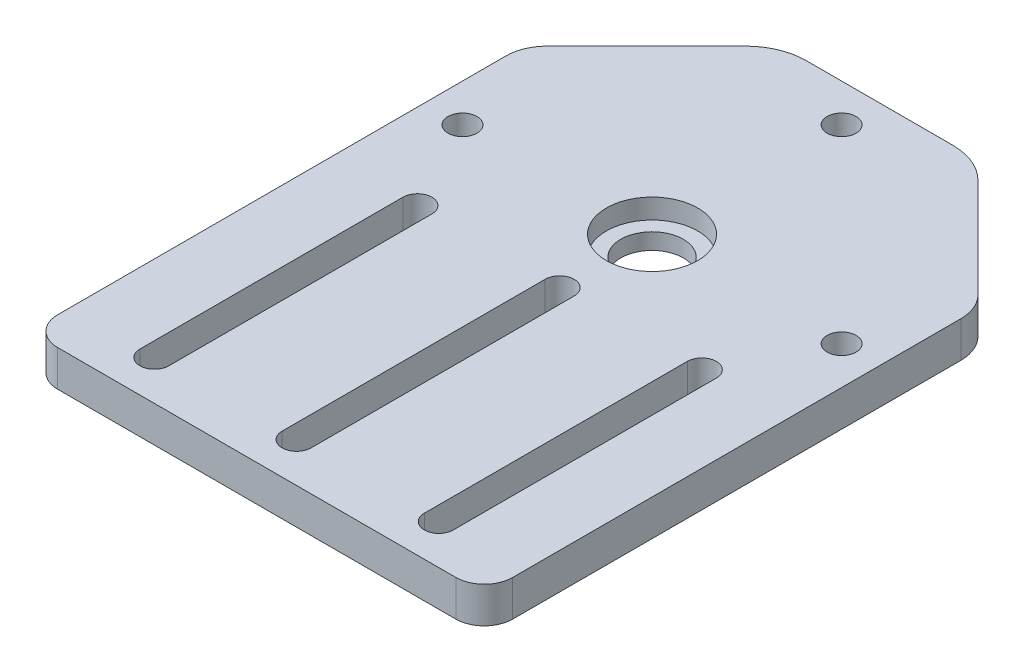
ISO-10303-21;
HEADER;
FILE_DESCRIPTION(('STEP AP214'),'2;1');
FILE_NAME('part.step','',(''),(''),'','','');
FILE_SCHEMA(('AUTOMOTIVE_DESIGN { 1 0 10303 214 1 1 1 1 }'));
ENDSEC;
DATA;
#1=APPLICATION_CONTEXT('core data for automotive mechanical design processes');
#2=APPLICATION_PROTOCOL_DEFINITION('international standard','automotive_design',2000,#1);
#3=PRODUCT_CONTEXT('',#1,'mechanical');
#4=PRODUCT('Part','Part','',(#3));
#5=PRODUCT_RELATED_PRODUCT_CATEGORY('part','',(#4));
#6=PRODUCT_DEFINITION_FORMATION('','',#4);
#7=PRODUCT_DEFINITION_CONTEXT('part definition',#1,'design');
#8=PRODUCT_DEFINITION('design','',#6,#7);
#9=PRODUCT_DEFINITION_SHAPE('','',#8);
#10=(LENGTH_UNIT() NAMED_UNIT(*) SI_UNIT(.MILLI.,.METRE.));
#11=(NAMED_UNIT(*) PLANE_ANGLE_UNIT() SI_UNIT($,.RADIAN.));
#12=(NAMED_UNIT(*) SI_UNIT($,.STERADIAN.) SOLID_ANGLE_UNIT());
#13=UNCERTAINTY_MEASURE_WITH_UNIT(LENGTH_MEASURE(1.E-05),#10,'distance_accuracy_value','');
#14=(GEOMETRIC_REPRESENTATION_CONTEXT(3) GLOBAL_UNCERTAINTY_ASSIGNED_CONTEXT((#13)) GLOBAL_UNIT_ASSIGNED_CONTEXT((#10,
#11,#12)) REPRESENTATION_CONTEXT('',''));
#15=CARTESIAN_POINT('',(0.,0.,0.));
#16=DIRECTION('',(0.,0.,1.));
#17=DIRECTION('',(1.,0.,0.));
#18=AXIS2_PLACEMENT_3D('',#15,#16,#17);
#19=CARTESIAN_POINT('',(0.,6.35,0.));
#20=DIRECTION('',(0.,-1.,0.));
#21=DIRECTION('',(0.,0.,-1.));
#22=AXIS2_PLACEMENT_3D('',#19,#20,#21);
#23=CYLINDRICAL_SURFACE('',#22,5.5);
#24=CARTESIAN_POINT('',(0.,0.,0.));
#25=DIRECTION('',(0.,1.,0.));
#26=DIRECTION('',(0.,0.,1.));
#27=AXIS2_PLACEMENT_3D('',#24,#25,#26);
#28=CIRCLE('',#27,5.5);
#29=CARTESIAN_POINT('',(0.,0.,5.5));
#30=VERTEX_POINT('',#29);
#31=EDGE_CURVE('E304',#30,#30,#28,.T.);
#32=ORIENTED_EDGE('',*,*,#31,.F.);
#33=EDGE_LOOP('',(#32));
#34=FACE_BOUND('',#33,.T.);
#35=CARTESIAN_POINT('',(0.,2.85,0.));
#36=DIRECTION('',(0.,1.,0.));
#37=DIRECTION('',(0.,0.,1.));
#38=AXIS2_PLACEMENT_3D('',#35,#36,#37);
#39=CIRCLE('',#38,5.5);
#40=CARTESIAN_POINT('',(0.,2.85,5.5));
#41=VERTEX_POINT('',#40);
#42=EDGE_CURVE('E45',#41,#41,#39,.T.);
#43=ORIENTED_EDGE('',*,*,#42,.T.);
#44=EDGE_LOOP('',(#43));
#45=FACE_BOUND('',#44,.T.);
#46=ADVANCED_FACE('F41',(#34,#45),#23,.F.);
#47=CARTESIAN_POINT('',(-35.,6.35,64.5));
#48=DIRECTION('',(0.,-1.,0.));
#49=DIRECTION('',(0.,0.,-1.));
#50=AXIS2_PLACEMENT_3D('',#47,#48,#49);
#51=PLANE('',#50);
#52=CARTESIAN_POINT('',(0.,6.35,0.));
#53=DIRECTION('',(0.,1.,0.));
#54=DIRECTION('',(0.,0.,1.));
#55=AXIS2_PLACEMENT_3D('',#52,#53,#54);
#56=CIRCLE('',#55,8.025);
#57=CARTESIAN_POINT('',(0.,6.35,8.025));
#58=VERTEX_POINT('',#57);
#59=EDGE_CURVE('E649',#58,#58,#56,.T.);
#60=ORIENTED_EDGE('',*,*,#59,.F.);
#61=EDGE_LOOP('',(#60));
#62=FACE_BOUND('',#61,.T.);
#63=CARTESIAN_POINT('',(0.,6.35,62.5));
#64=DIRECTION('',(0.,1.,0.));
#65=DIRECTION('',(0.,0.,1.));
#66=AXIS2_PLACEMENT_3D('',#63,#64,#65);
#67=CIRCLE('',#66,2.55);
#68=CARTESIAN_POINT('',(-2.55,6.35,62.5));
#69=VERTEX_POINT('',#68);
#70=CARTESIAN_POINT('',(2.55,6.35,62.5));
#71=VERTEX_POINT('',#70);
#72=EDGE_CURVE('E243',#69,#71,#67,.T.);
#73=ORIENTED_EDGE('',*,*,#72,.F.);
#74=DIRECTION('',(0.,0.,1.));
#75=VECTOR('',#74,1.);
#76=CARTESIAN_POINT('',(-2.55,6.35,62.5));
#77=LINE('',#76,#75);
#78=CARTESIAN_POINT('',(-2.55,6.35,16.25));
#79=VERTEX_POINT('',#78);
#80=EDGE_CURVE('E251',#79,#69,#77,.T.);
#81=ORIENTED_EDGE('',*,*,#80,.F.);
#82=CARTESIAN_POINT('',(0.,6.35,16.25));
#83=DIRECTION('',(0.,1.,0.));
#84=DIRECTION('',(0.,0.,1.));
#85=AXIS2_PLACEMENT_3D('',#82,#83,#84);
#86=CIRCLE('',#85,2.55);
#87=CARTESIAN_POINT('',(2.55,6.35,16.25));
#88=VERTEX_POINT('',#87);
#89=EDGE_CURVE('E248',#88,#79,#86,.T.);
#90=ORIENTED_EDGE('',*,*,#89,.F.);
#91=DIRECTION('',(0.,0.,-1.));
#92=VECTOR('',#91,1.);
#93=CARTESIAN_POINT('',(2.55,6.35,62.5));
#94=LINE('',#93,#92);
#95=EDGE_CURVE('E245',#71,#88,#94,.T.);
#96=ORIENTED_EDGE('',*,*,#95,.F.);
#97=EDGE_LOOP('',(#73,#81,#90,#96));
#98=FACE_BOUND('',#97,.T.);
#99=DIRECTION('',(0.,0.,1.));
#100=VECTOR('',#99,1.);
#101=CARTESIAN_POINT('',(-40.,6.35,27.5));
#102=LINE('',#101,#100);
#103=CARTESIAN_POINT('',(-40.,6.35,-14.3069516727951));
#104=VERTEX_POINT('',#103);
#105=CARTESIAN_POINT('',(-40.,6.35,64.5));
#106=VERTEX_POINT('',#105);
#107=EDGE_CURVE('E308',#104,#106,#102,.T.);
#108=ORIENTED_EDGE('',*,*,#107,.T.);
#109=CARTESIAN_POINT('',(-35.,6.35,64.5));
#110=DIRECTION('',(0.,1.,0.));
#111=DIRECTION('',(0.,0.,-1.));
#112=AXIS2_PLACEMENT_3D('',#109,#110,#111);
#113=CIRCLE('',#112,4.99999999999999);
#114=CARTESIAN_POINT('',(-35.,6.35,69.5));
#115=VERTEX_POINT('',#114);
#116=EDGE_CURVE('E311',#106,#115,#113,.T.);
#117=ORIENTED_EDGE('',*,*,#116,.T.);
#118=DIRECTION('',(1.,0.,0.));
#119=VECTOR('',#118,1.);
#120=CARTESIAN_POINT('',(-35.,6.35,69.5));
#121=LINE('',#120,#119);
#122=CARTESIAN_POINT('',(35.,6.35,69.5));
#123=VERTEX_POINT('',#122);
#124=EDGE_CURVE('E314',#115,#123,#121,.T.);
#125=ORIENTED_EDGE('',*,*,#124,.T.);
#126=CARTESIAN_POINT('',(35.,6.35,64.5));
#127=DIRECTION('',(0.,1.,0.));
#128=DIRECTION('',(0.,0.,-1.));
#129=AXIS2_PLACEMENT_3D('',#126,#127,#128);
#130=CIRCLE('',#129,4.99999999999999);
#131=CARTESIAN_POINT('',(40.,6.35,64.5));
#132=VERTEX_POINT('',#131);
#133=EDGE_CURVE('E316',#123,#132,#130,.T.);
#134=ORIENTED_EDGE('',*,*,#133,.T.);
#135=DIRECTION('',(0.,0.,-1.));
#136=VECTOR('',#135,1.);
#137=CARTESIAN_POINT('',(40.,6.35,64.5));
#138=LINE('',#137,#136);
#139=CARTESIAN_POINT('',(40.,6.35,-14.3069516727951));
#140=VERTEX_POINT('',#139);
#141=EDGE_CURVE('E318',#132,#140,#138,.T.);
#142=ORIENTED_EDGE('',*,*,#141,.T.);
#143=CARTESIAN_POINT('',(32.75,6.35,-14.3069516727951));
#144=DIRECTION('',(0.,1.,0.));
#145=DIRECTION('',(0.,0.,-1.));
#146=AXIS2_PLACEMENT_3D('',#143,#144,#145);
#147=CIRCLE('',#146,7.25);
#148=CARTESIAN_POINT('',(37.8765241636025,6.35,-19.4334758363976));
#149=VERTEX_POINT('',#148);
#150=EDGE_CURVE('E320',#140,#149,#147,.T.);
#151=ORIENTED_EDGE('',*,*,#150,.T.);
#152=DIRECTION('',(-0.707106781186549,0.,-0.707106781186546));
#153=VECTOR('',#152,1.);
#154=CARTESIAN_POINT('',(37.8765241636025,6.35,-19.4334758363976));
#155=LINE('',#154,#153);
#156=CARTESIAN_POINT('',(20.4380995769277,6.35,-36.8719004230723));
#157=VERTEX_POINT('',#156);
#158=EDGE_CURVE('E322',#149,#157,#155,.T.);
#159=ORIENTED_EDGE('',*,*,#158,.T.);
#160=CARTESIAN_POINT('',(12.8861991538554,6.35,-29.32));
#161=DIRECTION('',(0.,1.,0.));
#162=DIRECTION('',(0.,0.,-1.));
#163=AXIS2_PLACEMENT_3D('',#160,#161,#162);
#164=CIRCLE('',#163,10.68);
#165=CARTESIAN_POINT('',(12.8861991538554,6.35,-40.));
#166=VERTEX_POINT('',#165);
#167=EDGE_CURVE('E324',#157,#166,#164,.T.);
#168=ORIENTED_EDGE('',*,*,#167,.T.);
#169=DIRECTION('',(-1.,0.,0.));
#170=VECTOR('',#169,1.);
#171=CARTESIAN_POINT('',(12.8861991538554,6.35,-40.));
#172=LINE('',#171,#170);
#173=CARTESIAN_POINT('',(-12.8861991538554,6.35,-40.));
#174=VERTEX_POINT('',#173);
#175=EDGE_CURVE('E326',#166,#174,#172,.T.);
#176=ORIENTED_EDGE('',*,*,#175,.T.);
#177=CARTESIAN_POINT('',(-12.8861991538554,6.35,-29.32));
#178=DIRECTION('',(0.,1.,0.));
#179=DIRECTION('',(0.,0.,-1.));
#180=AXIS2_PLACEMENT_3D('',#177,#178,#179);
#181=CIRCLE('',#180,10.68);
#182=CARTESIAN_POINT('',(-20.4380995769277,6.35,-36.8719004230723));
#183=VERTEX_POINT('',#182);
#184=EDGE_CURVE('E328',#174,#183,#181,.T.);
#185=ORIENTED_EDGE('',*,*,#184,.T.);
#186=DIRECTION('',(-0.707106781186549,0.,0.707106781186546));
#187=VECTOR('',#186,1.);
#188=CARTESIAN_POINT('',(-37.8765241636025,6.35,-19.4334758363976));
#189=LINE('',#188,#187);
#190=CARTESIAN_POINT('',(-37.8765241636025,6.35,-19.4334758363976));
#191=VERTEX_POINT('',#190);
#192=EDGE_CURVE('E330',#183,#191,#189,.T.);
#193=ORIENTED_EDGE('',*,*,#192,.T.);
#194=CARTESIAN_POINT('',(-32.75,6.35,-14.3069516727951));
#195=DIRECTION('',(0.,1.,0.));
#196=DIRECTION('',(0.,0.,1.));
#197=AXIS2_PLACEMENT_3D('',#194,#195,#196);
#198=CIRCLE('',#197,7.25);
#199=EDGE_CURVE('E332',#191,#104,#198,.T.);
#200=ORIENTED_EDGE('',*,*,#199,.T.);
#201=EDGE_LOOP('',(#108,#117,#125,#134,#142,#151,#159,#168,#176,#185,#193,#200));
#202=FACE_BOUND('',#201,.T.);
#203=CARTESIAN_POINT('',(25.,6.35,62.5));
#204=DIRECTION('',(0.,1.,0.));
#205=DIRECTION('',(0.,0.,1.));
#206=AXIS2_PLACEMENT_3D('',#203,#204,#205);
#207=CIRCLE('',#206,2.55);
#208=CARTESIAN_POINT('',(22.45,6.35,62.5));
#209=VERTEX_POINT('',#208);
#210=CARTESIAN_POINT('',(27.55,6.35,62.5));
#211=VERTEX_POINT('',#210);
#212=EDGE_CURVE('E274',#209,#211,#207,.T.);
#213=ORIENTED_EDGE('',*,*,#212,.F.);
#214=DIRECTION('',(0.,0.,1.));
#215=VECTOR('',#214,1.);
#216=CARTESIAN_POINT('',(22.45,6.35,62.5));
#217=LINE('',#216,#215);
#218=CARTESIAN_POINT('',(22.45,6.35,16.25));
#219=VERTEX_POINT('',#218);
#220=EDGE_CURVE('E282',#219,#209,#217,.T.);
#221=ORIENTED_EDGE('',*,*,#220,.F.);
#222=CARTESIAN_POINT('',(25.,6.35,16.25));
#223=DIRECTION('',(0.,1.,0.));
#224=DIRECTION('',(0.,0.,1.));
#225=AXIS2_PLACEMENT_3D('',#222,#223,#224);
#226=CIRCLE('',#225,2.55);
#227=CARTESIAN_POINT('',(27.55,6.35,16.25));
#228=VERTEX_POINT('',#227);
#229=EDGE_CURVE('E279',#228,#219,#226,.T.);
#230=ORIENTED_EDGE('',*,*,#229,.F.);
#231=DIRECTION('',(0.,0.,-1.));
#232=VECTOR('',#231,1.);
#233=CARTESIAN_POINT('',(27.55,6.35,62.5));
#234=LINE('',#233,#232);
#235=EDGE_CURVE('E276',#211,#228,#234,.T.);
#236=ORIENTED_EDGE('',*,*,#235,.F.);
#237=EDGE_LOOP('',(#213,#221,#230,#236));
#238=FACE_BOUND('',#237,.T.);
#239=CARTESIAN_POINT('',(-25.,6.35,62.5));
#240=DIRECTION('',(0.,1.,0.));
#241=DIRECTION('',(0.,0.,1.));
#242=AXIS2_PLACEMENT_3D('',#239,#240,#241);
#243=CIRCLE('',#242,2.55);
#244=CARTESIAN_POINT('',(-27.55,6.35,62.5));
#245=VERTEX_POINT('',#244);
#246=CARTESIAN_POINT('',(-22.45,6.35,62.5));
#247=VERTEX_POINT('',#246);
#248=EDGE_CURVE('E203',#245,#247,#243,.T.);
#249=ORIENTED_EDGE('',*,*,#248,.F.);
#250=DIRECTION('',(0.,0.,1.));
#251=VECTOR('',#250,1.);
#252=CARTESIAN_POINT('',(-27.55,6.35,62.5));
#253=LINE('',#252,#251);
#254=CARTESIAN_POINT('',(-27.55,6.35,16.25));
#255=VERTEX_POINT('',#254);
#256=EDGE_CURVE('E227',#255,#245,#253,.T.);
#257=ORIENTED_EDGE('',*,*,#256,.F.);
#258=CARTESIAN_POINT('',(-25.,6.35,16.25));
#259=DIRECTION('',(0.,1.,0.));
#260=DIRECTION('',(0.,0.,1.));
#261=AXIS2_PLACEMENT_3D('',#258,#259,#260);
#262=CIRCLE('',#261,2.55);
#263=CARTESIAN_POINT('',(-22.45,6.35,16.25));
#264=VERTEX_POINT('',#263);
#265=EDGE_CURVE('E225',#264,#255,#262,.T.);
#266=ORIENTED_EDGE('',*,*,#265,.F.);
#267=DIRECTION('',(0.,0.,-1.));
#268=VECTOR('',#267,1.);
#269=CARTESIAN_POINT('',(-22.45,6.35,62.5));
#270=LINE('',#269,#268);
#271=EDGE_CURVE('E211',#247,#264,#270,.T.);
#272=ORIENTED_EDGE('',*,*,#271,.F.);
#273=EDGE_LOOP('',(#249,#257,#266,#272));
#274=FACE_BOUND('',#273,.T.);
#275=CARTESIAN_POINT('',(-33.3330136651339,6.35,0.));
#276=DIRECTION('',(0.,1.,0.));
#277=DIRECTION('',(0.,0.,1.));
#278=AXIS2_PLACEMENT_3D('',#275,#276,#277);
#279=CIRCLE('',#278,2.55);
#280=CARTESIAN_POINT('',(-33.3330136651339,6.35,2.55));
#281=VERTEX_POINT('',#280);
#282=EDGE_CURVE('E233',#281,#281,#279,.T.);
#283=ORIENTED_EDGE('',*,*,#282,.F.);
#284=EDGE_LOOP('',(#283));
#285=FACE_BOUND('',#284,.T.);
#286=CARTESIAN_POINT('',(0.,6.35,-33.3330136651339));
#287=DIRECTION('',(0.,1.,0.));
#288=DIRECTION('',(0.,0.,1.));
#289=AXIS2_PLACEMENT_3D('',#286,#287,#288);
#290=CIRCLE('',#289,2.55);
#291=CARTESIAN_POINT('',(0.,6.35,-30.7830136651339));
#292=VERTEX_POINT('',#291);
#293=EDGE_CURVE('E661',#292,#292,#290,.T.);
#294=ORIENTED_EDGE('',*,*,#293,.F.);
#295=EDGE_LOOP('',(#294));
#296=FACE_BOUND('',#295,.T.);
#297=CARTESIAN_POINT('',(33.3330136651339,6.35,0.));
#298=DIRECTION('',(0.,1.,0.));
#299=DIRECTION('',(0.,0.,-1.));
#300=AXIS2_PLACEMENT_3D('',#297,#298,#299);
#301=CIRCLE('',#300,2.55);
#302=CARTESIAN_POINT('',(33.3330136651339,6.35,-2.55));
#303=VERTEX_POINT('',#302);
#304=EDGE_CURVE('E655',#303,#303,#301,.T.);
#305=ORIENTED_EDGE('',*,*,#304,.F.);
#306=EDGE_LOOP('',(#305));
#307=FACE_BOUND('',#306,.T.);
#308=ADVANCED_FACE('F223',(#62,#98,#202,#238,#274,#285,#296,#307),#51,.F.);
#309=CARTESIAN_POINT('',(-35.,0.,64.5));
#310=DIRECTION('',(0.,-1.,0.));
#311=DIRECTION('',(0.,0.,-1.));
#312=AXIS2_PLACEMENT_3D('',#309,#310,#311);
#313=PLANE('',#312);
#314=CARTESIAN_POINT('',(0.,0.,-33.3330136651339));
#315=DIRECTION('',(0.,1.,0.));
#316=DIRECTION('',(0.,0.,1.));
#317=AXIS2_PLACEMENT_3D('',#314,#315,#316);
#318=CIRCLE('',#317,2.55);
#319=CARTESIAN_POINT('',(0.,0.,-30.7830136651339));
#320=VERTEX_POINT('',#319);
#321=EDGE_CURVE('E658',#320,#320,#318,.T.);
#322=ORIENTED_EDGE('',*,*,#321,.T.);
#323=EDGE_LOOP('',(#322));
#324=FACE_BOUND('',#323,.T.);
#325=DIRECTION('',(0.,0.,1.));
#326=VECTOR('',#325,1.);
#327=CARTESIAN_POINT('',(-27.55,0.,62.5));
#328=LINE('',#327,#326);
#329=CARTESIAN_POINT('',(-27.55,0.,16.25));
#330=VERTEX_POINT('',#329);
#331=CARTESIAN_POINT('',(-27.55,0.,62.5));
#332=VERTEX_POINT('',#331);
#333=EDGE_CURVE('E212',#330,#332,#328,.T.);
#334=ORIENTED_EDGE('',*,*,#333,.T.);
#335=CARTESIAN_POINT('',(-25.,0.,62.5));
#336=DIRECTION('',(0.,1.,0.));
#337=DIRECTION('',(0.,0.,1.));
#338=AXIS2_PLACEMENT_3D('',#335,#336,#337);
#339=CIRCLE('',#338,2.55);
#340=CARTESIAN_POINT('',(-22.45,0.,62.5));
#341=VERTEX_POINT('',#340);
#342=EDGE_CURVE('E65',#332,#341,#339,.T.);
#343=ORIENTED_EDGE('',*,*,#342,.T.);
#344=DIRECTION('',(0.,0.,-1.));
#345=VECTOR('',#344,1.);
#346=CARTESIAN_POINT('',(-22.45,0.,62.5));
#347=LINE('',#346,#345);
#348=CARTESIAN_POINT('',(-22.45,0.,16.25));
#349=VERTEX_POINT('',#348);
#350=EDGE_CURVE('E218',#341,#349,#347,.T.);
#351=ORIENTED_EDGE('',*,*,#350,.T.);
#352=CARTESIAN_POINT('',(-25.,0.,16.25));
#353=DIRECTION('',(0.,1.,0.));
#354=DIRECTION('',(0.,0.,1.));
#355=AXIS2_PLACEMENT_3D('',#352,#353,#354);
#356=CIRCLE('',#355,2.55);
#357=EDGE_CURVE('E235',#349,#330,#356,.T.);
#358=ORIENTED_EDGE('',*,*,#357,.T.);
#359=EDGE_LOOP('',(#334,#343,#351,#358));
#360=FACE_BOUND('',#359,.T.);
#361=DIRECTION('',(0.,0.,1.));
#362=VECTOR('',#361,1.);
#363=CARTESIAN_POINT('',(-2.55,0.,62.5));
#364=LINE('',#363,#362);
#365=CARTESIAN_POINT('',(-2.55,0.,16.25));
#366=VERTEX_POINT('',#365);
#367=CARTESIAN_POINT('',(-2.55,0.,62.5));
#368=VERTEX_POINT('',#367);
#369=EDGE_CURVE('E246',#366,#368,#364,.T.);
#370=ORIENTED_EDGE('',*,*,#369,.T.);
#371=CARTESIAN_POINT('',(0.,0.,62.5));
#372=DIRECTION('',(0.,1.,0.));
#373=DIRECTION('',(0.,0.,1.));
#374=AXIS2_PLACEMENT_3D('',#371,#372,#373);
#375=CIRCLE('',#374,2.55);
#376=CARTESIAN_POINT('',(2.55,0.,62.5));
#377=VERTEX_POINT('',#376);
#378=EDGE_CURVE('E219',#368,#377,#375,.T.);
#379=ORIENTED_EDGE('',*,*,#378,.T.);
#380=DIRECTION('',(0.,0.,-1.));
#381=VECTOR('',#380,1.);
#382=CARTESIAN_POINT('',(2.55,0.,62.5));
#383=LINE('',#382,#381);
#384=CARTESIAN_POINT('',(2.55,0.,16.25));
#385=VERTEX_POINT('',#384);
#386=EDGE_CURVE('E256',#377,#385,#383,.T.);
#387=ORIENTED_EDGE('',*,*,#386,.T.);
#388=CARTESIAN_POINT('',(0.,0.,16.25));
#389=DIRECTION('',(0.,1.,0.));
#390=DIRECTION('',(0.,0.,1.));
#391=AXIS2_PLACEMENT_3D('',#388,#389,#390);
#392=CIRCLE('',#391,2.55);
#393=EDGE_CURVE('E259',#385,#366,#392,.T.);
#394=ORIENTED_EDGE('',*,*,#393,.T.);
#395=EDGE_LOOP('',(#370,#379,#387,#394));
#396=FACE_BOUND('',#395,.T.);
#397=DIRECTION('',(0.,0.,1.));
#398=VECTOR('',#397,1.);
#399=CARTESIAN_POINT('',(22.45,0.,62.5));
#400=LINE('',#399,#398);
#401=CARTESIAN_POINT('',(22.45,0.,16.25));
#402=VERTEX_POINT('',#401);
#403=CARTESIAN_POINT('',(22.45,0.,62.5));
#404=VERTEX_POINT('',#403);
#405=EDGE_CURVE('E277',#402,#404,#400,.T.);
#406=ORIENTED_EDGE('',*,*,#405,.T.);
#407=CARTESIAN_POINT('',(25.,0.,62.5));
#408=DIRECTION('',(0.,1.,0.));
#409=DIRECTION('',(0.,0.,1.));
#410=AXIS2_PLACEMENT_3D('',#407,#408,#409);
#411=CIRCLE('',#410,2.55);
#412=CARTESIAN_POINT('',(27.55,0.,62.5));
#413=VERTEX_POINT('',#412);
#414=EDGE_CURVE('E273',#404,#413,#411,.T.);
#415=ORIENTED_EDGE('',*,*,#414,.T.);
#416=DIRECTION('',(0.,0.,-1.));
#417=VECTOR('',#416,1.);
#418=CARTESIAN_POINT('',(27.55,0.,62.5));
#419=LINE('',#418,#417);
#420=CARTESIAN_POINT('',(27.55,0.,16.25));
#421=VERTEX_POINT('',#420);
#422=EDGE_CURVE('E287',#413,#421,#419,.T.);
#423=ORIENTED_EDGE('',*,*,#422,.T.);
#424=CARTESIAN_POINT('',(25.,0.,16.25));
#425=DIRECTION('',(0.,1.,0.));
#426=DIRECTION('',(0.,0.,1.));
#427=AXIS2_PLACEMENT_3D('',#424,#425,#426);
#428=CIRCLE('',#427,2.55);
#429=EDGE_CURVE('E290',#421,#402,#428,.T.);
#430=ORIENTED_EDGE('',*,*,#429,.T.);
#431=EDGE_LOOP('',(#406,#415,#423,#430));
#432=FACE_BOUND('',#431,.T.);
#433=ORIENTED_EDGE('',*,*,#31,.T.);
#434=EDGE_LOOP('',(#433));
#435=FACE_BOUND('',#434,.T.);
#436=CARTESIAN_POINT('',(-35.,0.,64.5));
#437=DIRECTION('',(0.,1.,0.));
#438=DIRECTION('',(0.,0.,-1.));
#439=AXIS2_PLACEMENT_3D('',#436,#437,#438);
#440=CIRCLE('',#439,4.99999999999999);
#441=CARTESIAN_POINT('',(-40.,0.,64.5));
#442=VERTEX_POINT('',#441);
#443=CARTESIAN_POINT('',(-35.,0.,69.5));
#444=VERTEX_POINT('',#443);
#445=EDGE_CURVE('E307',#442,#444,#440,.T.);
#446=ORIENTED_EDGE('',*,*,#445,.F.);
#447=DIRECTION('',(0.,0.,1.));
#448=VECTOR('',#447,1.);
#449=CARTESIAN_POINT('',(-40.,0.,27.5));
#450=LINE('',#449,#448);
#451=CARTESIAN_POINT('',(-40.,0.,-14.3069516727951));
#452=VERTEX_POINT('',#451);
#453=EDGE_CURVE('E312',#452,#442,#450,.T.);
#454=ORIENTED_EDGE('',*,*,#453,.F.);
#455=CARTESIAN_POINT('',(-32.75,0.,-14.3069516727951));
#456=DIRECTION('',(0.,1.,0.));
#457=DIRECTION('',(0.,0.,1.));
#458=AXIS2_PLACEMENT_3D('',#455,#456,#457);
#459=CIRCLE('',#458,7.25);
#460=CARTESIAN_POINT('',(-37.8765241636025,0.,-19.4334758363976));
#461=VERTEX_POINT('',#460);
#462=EDGE_CURVE('E356',#461,#452,#459,.T.);
#463=ORIENTED_EDGE('',*,*,#462,.F.);
#464=DIRECTION('',(-0.707106781186549,0.,0.707106781186546));
#465=VECTOR('',#464,1.);
#466=CARTESIAN_POINT('',(-37.8765241636025,0.,-19.4334758363976));
#467=LINE('',#466,#465);
#468=CARTESIAN_POINT('',(-20.4380995769277,0.,-36.8719004230723));
#469=VERTEX_POINT('',#468);
#470=EDGE_CURVE('E354',#469,#461,#467,.T.);
#471=ORIENTED_EDGE('',*,*,#470,.F.);
#472=CARTESIAN_POINT('',(-12.8861991538554,0.,-29.32));
#473=DIRECTION('',(0.,1.,0.));
#474=DIRECTION('',(0.,0.,-1.));
#475=AXIS2_PLACEMENT_3D('',#472,#473,#474);
#476=CIRCLE('',#475,10.68);
#477=CARTESIAN_POINT('',(-12.8861991538554,0.,-40.));
#478=VERTEX_POINT('',#477);
#479=EDGE_CURVE('E352',#478,#469,#476,.T.);
#480=ORIENTED_EDGE('',*,*,#479,.F.);
#481=DIRECTION('',(-1.,0.,0.));
#482=VECTOR('',#481,1.);
#483=CARTESIAN_POINT('',(12.8861991538554,0.,-40.));
#484=LINE('',#483,#482);
#485=CARTESIAN_POINT('',(12.8861991538554,0.,-40.));
#486=VERTEX_POINT('',#485);
#487=EDGE_CURVE('E350',#486,#478,#484,.T.);
#488=ORIENTED_EDGE('',*,*,#487,.F.);
#489=CARTESIAN_POINT('',(12.8861991538554,0.,-29.32));
#490=DIRECTION('',(0.,1.,0.));
#491=DIRECTION('',(0.,0.,-1.));
#492=AXIS2_PLACEMENT_3D('',#489,#490,#491);
#493=CIRCLE('',#492,10.68);
#494=CARTESIAN_POINT('',(20.4380995769277,0.,-36.8719004230723));
#495=VERTEX_POINT('',#494);
#496=EDGE_CURVE('E348',#495,#486,#493,.T.);
#497=ORIENTED_EDGE('',*,*,#496,.F.);
#498=DIRECTION('',(-0.707106781186549,0.,-0.707106781186546));
#499=VECTOR('',#498,1.);
#500=CARTESIAN_POINT('',(37.8765241636025,0.,-19.4334758363976));
#501=LINE('',#500,#499);
#502=CARTESIAN_POINT('',(37.8765241636025,0.,-19.4334758363976));
#503=VERTEX_POINT('',#502);
#504=EDGE_CURVE('E346',#503,#495,#501,.T.);
#505=ORIENTED_EDGE('',*,*,#504,.F.);
#506=CARTESIAN_POINT('',(32.75,0.,-14.3069516727951));
#507=DIRECTION('',(0.,1.,0.));
#508=DIRECTION('',(0.,0.,-1.));
#509=AXIS2_PLACEMENT_3D('',#506,#507,#508);
#510=CIRCLE('',#509,7.25);
#511=CARTESIAN_POINT('',(40.,0.,-14.3069516727951));
#512=VERTEX_POINT('',#511);
#513=EDGE_CURVE('E344',#512,#503,#510,.T.);
#514=ORIENTED_EDGE('',*,*,#513,.F.);
#515=DIRECTION('',(0.,0.,-1.));
#516=VECTOR('',#515,1.);
#517=CARTESIAN_POINT('',(40.,0.,27.5));
#518=LINE('',#517,#516);
#519=CARTESIAN_POINT('',(40.,0.,64.5));
#520=VERTEX_POINT('',#519);
#521=EDGE_CURVE('E342',#520,#512,#518,.T.);
#522=ORIENTED_EDGE('',*,*,#521,.F.);
#523=CARTESIAN_POINT('',(35.,0.,64.5));
#524=DIRECTION('',(0.,1.,0.));
#525=DIRECTION('',(0.,0.,-1.));
#526=AXIS2_PLACEMENT_3D('',#523,#524,#525);
#527=CIRCLE('',#526,4.99999999999999);
#528=CARTESIAN_POINT('',(35.,0.,69.5));
#529=VERTEX_POINT('',#528);
#530=EDGE_CURVE('E339',#529,#520,#527,.T.);
#531=ORIENTED_EDGE('',*,*,#530,.F.);
#532=DIRECTION('',(1.,0.,0.));
#533=VECTOR('',#532,1.);
#534=CARTESIAN_POINT('',(-35.,0.,69.5));
#535=LINE('',#534,#533);
#536=EDGE_CURVE('E337',#444,#529,#535,.T.);
#537=ORIENTED_EDGE('',*,*,#536,.F.);
#538=EDGE_LOOP('',(#446,#454,#463,#471,#480,#488,#497,#505,#514,#522,#531,#537));
#539=FACE_BOUND('',#538,.T.);
#540=CARTESIAN_POINT('',(-33.3330136651339,0.,0.));
#541=DIRECTION('',(0.,1.,0.));
#542=DIRECTION('',(0.,0.,1.));
#543=AXIS2_PLACEMENT_3D('',#540,#541,#542);
#544=CIRCLE('',#543,2.55);
#545=CARTESIAN_POINT('',(-33.3330136651339,0.,2.55));
#546=VERTEX_POINT('',#545);
#547=EDGE_CURVE('E664',#546,#546,#544,.T.);
#548=ORIENTED_EDGE('',*,*,#547,.T.);
#549=EDGE_LOOP('',(#548));
#550=FACE_BOUND('',#549,.T.);
#551=CARTESIAN_POINT('',(33.3330136651339,0.,0.));
#552=DIRECTION('',(0.,1.,0.));
#553=DIRECTION('',(0.,0.,-1.));
#554=AXIS2_PLACEMENT_3D('',#551,#552,#553);
#555=CIRCLE('',#554,2.55);
#556=CARTESIAN_POINT('',(33.3330136651339,0.,-2.55));
#557=VERTEX_POINT('',#556);
#558=EDGE_CURVE('E651',#557,#557,#555,.T.);
#559=ORIENTED_EDGE('',*,*,#558,.T.);
#560=EDGE_LOOP('',(#559));
#561=FACE_BOUND('',#560,.T.);
#562=ADVANCED_FACE('F399',(#324,#360,#396,#432,#435,#539,#550,#561),#313,.T.);
#563=CARTESIAN_POINT('',(-35.,6.35,64.5));
#564=DIRECTION('',(0.,-1.,0.));
#565=DIRECTION('',(0.,0.,-1.));
#566=AXIS2_PLACEMENT_3D('',#563,#564,#565);
#567=CYLINDRICAL_SURFACE('',#566,4.99999999999999);
#568=ORIENTED_EDGE('',*,*,#445,.T.);
#569=DIRECTION('',(0.,-1.,0.));
#570=VECTOR('',#569,1.);
#571=CARTESIAN_POINT('',(-35.,6.35,69.5));
#572=LINE('',#571,#570);
#573=EDGE_CURVE('E50',#115,#444,#572,.T.);
#574=ORIENTED_EDGE('',*,*,#573,.F.);
#575=ORIENTED_EDGE('',*,*,#116,.F.);
#576=DIRECTION('',(0.,-1.,0.));
#577=VECTOR('',#576,1.);
#578=CARTESIAN_POINT('',(-40.,6.35,64.5));
#579=LINE('',#578,#577);
#580=EDGE_CURVE('E11',#106,#442,#579,.T.);
#581=ORIENTED_EDGE('',*,*,#580,.T.);
#582=EDGE_LOOP('',(#568,#574,#575,#581));
#583=FACE_BOUND('',#582,.T.);
#584=ADVANCED_FACE('F43',(#583),#567,.T.);
#585=CARTESIAN_POINT('',(-35.,6.35,69.5));
#586=DIRECTION('',(0.,0.,-1.));
#587=DIRECTION('',(-1.,0.,0.));
#588=AXIS2_PLACEMENT_3D('',#585,#586,#587);
#589=PLANE('',#588);
#590=ORIENTED_EDGE('',*,*,#536,.T.);
#591=DIRECTION('',(0.,-1.,0.));
#592=VECTOR('',#591,1.);
#593=CARTESIAN_POINT('',(35.,6.35,69.5));
#594=LINE('',#593,#592);
#595=EDGE_CURVE('E385',#123,#529,#594,.T.);
#596=ORIENTED_EDGE('',*,*,#595,.F.);
#597=ORIENTED_EDGE('',*,*,#124,.F.);
#598=ORIENTED_EDGE('',*,*,#573,.T.);
#599=EDGE_LOOP('',(#590,#596,#597,#598));
#600=FACE_BOUND('',#599,.T.);
#601=ADVANCED_FACE('F393',(#600),#589,.F.);
#602=CARTESIAN_POINT('',(35.,6.35,64.5));
#603=DIRECTION('',(0.,-1.,0.));
#604=DIRECTION('',(0.,0.,-1.));
#605=AXIS2_PLACEMENT_3D('',#602,#603,#604);
#606=CYLINDRICAL_SURFACE('',#605,4.99999999999999);
#607=ORIENTED_EDGE('',*,*,#530,.T.);
#608=DIRECTION('',(0.,-1.,0.));
#609=VECTOR('',#608,1.);
#610=CARTESIAN_POINT('',(40.,6.35,64.5));
#611=LINE('',#610,#609);
#612=EDGE_CURVE('E382',#132,#520,#611,.T.);
#613=ORIENTED_EDGE('',*,*,#612,.F.);
#614=ORIENTED_EDGE('',*,*,#133,.F.);
#615=ORIENTED_EDGE('',*,*,#595,.T.);
#616=EDGE_LOOP('',(#607,#613,#614,#615));
#617=FACE_BOUND('',#616,.T.);
#618=ADVANCED_FACE('F405',(#617),#606,.T.);
#619=CARTESIAN_POINT('',(40.,6.35,27.5));
#620=DIRECTION('',(-1.,0.,0.));
#621=DIRECTION('',(0.,0.,1.));
#622=AXIS2_PLACEMENT_3D('',#619,#620,#621);
#623=PLANE('',#622);
#624=ORIENTED_EDGE('',*,*,#521,.T.);
#625=DIRECTION('',(0.,-1.,0.));
#626=VECTOR('',#625,1.);
#627=CARTESIAN_POINT('',(40.,6.35,-14.3069516727951));
#628=LINE('',#627,#626);
#629=EDGE_CURVE('E379',#140,#512,#628,.T.);
#630=ORIENTED_EDGE('',*,*,#629,.F.);
#631=ORIENTED_EDGE('',*,*,#141,.F.);
#632=ORIENTED_EDGE('',*,*,#612,.T.);
#633=EDGE_LOOP('',(#624,#630,#631,#632));
#634=FACE_BOUND('',#633,.T.);
#635=ADVANCED_FACE('F409',(#634),#623,.F.);
#636=CARTESIAN_POINT('',(32.75,6.35,-14.3069516727951));
#637=DIRECTION('',(0.,-1.,0.));
#638=DIRECTION('',(0.,0.,-1.));
#639=AXIS2_PLACEMENT_3D('',#636,#637,#638);
#640=CYLINDRICAL_SURFACE('',#639,7.25);
#641=ORIENTED_EDGE('',*,*,#513,.T.);
#642=DIRECTION('',(0.,-1.,0.));
#643=VECTOR('',#642,1.);
#644=CARTESIAN_POINT('',(37.8765241636025,6.35,-19.4334758363976));
#645=LINE('',#644,#643);
#646=EDGE_CURVE('E376',#149,#503,#645,.T.);
#647=ORIENTED_EDGE('',*,*,#646,.F.);
#648=ORIENTED_EDGE('',*,*,#150,.F.);
#649=ORIENTED_EDGE('',*,*,#629,.T.);
#650=EDGE_LOOP('',(#641,#647,#648,#649));
#651=FACE_BOUND('',#650,.T.);
#652=ADVANCED_FACE('F449',(#651),#640,.T.);
#653=CARTESIAN_POINT('',(37.8765241636025,6.35,-19.4334758363976));
#654=DIRECTION('',(-0.707106781186546,0.,0.707106781186548));
#655=DIRECTION('',(0.707106781186549,0.,0.707106781186547));
#656=AXIS2_PLACEMENT_3D('',#653,#654,#655);
#657=PLANE('',#656);
#658=ORIENTED_EDGE('',*,*,#504,.T.);
#659=DIRECTION('',(0.,-1.,0.));
#660=VECTOR('',#659,1.);
#661=CARTESIAN_POINT('',(20.4380995769277,6.35,-36.8719004230723));
#662=LINE('',#661,#660);
#663=EDGE_CURVE('E373',#157,#495,#662,.T.);
#664=ORIENTED_EDGE('',*,*,#663,.F.);
#665=ORIENTED_EDGE('',*,*,#158,.F.);
#666=ORIENTED_EDGE('',*,*,#646,.T.);
#667=EDGE_LOOP('',(#658,#664,#665,#666));
#668=FACE_BOUND('',#667,.T.);
#669=ADVANCED_FACE('F447',(#668),#657,.F.);
#670=CARTESIAN_POINT('',(12.8861991538554,6.35,-29.32));
#671=DIRECTION('',(0.,-1.,0.));
#672=DIRECTION('',(0.,0.,-1.));
#673=AXIS2_PLACEMENT_3D('',#670,#671,#672);
#674=CYLINDRICAL_SURFACE('',#673,10.68);
#675=ORIENTED_EDGE('',*,*,#496,.T.);
#676=DIRECTION('',(0.,-1.,0.));
#677=VECTOR('',#676,1.);
#678=CARTESIAN_POINT('',(12.8861991538554,6.35,-40.));
#679=LINE('',#678,#677);
#680=EDGE_CURVE('E370',#166,#486,#679,.T.);
#681=ORIENTED_EDGE('',*,*,#680,.F.);
#682=ORIENTED_EDGE('',*,*,#167,.F.);
#683=ORIENTED_EDGE('',*,*,#663,.T.);
#684=EDGE_LOOP('',(#675,#681,#682,#683));
#685=FACE_BOUND('',#684,.T.);
#686=ADVANCED_FACE('F443',(#685),#674,.T.);
#687=CARTESIAN_POINT('',(12.8861991538554,6.35,-40.));
#688=DIRECTION('',(0.,0.,1.));
#689=DIRECTION('',(1.,0.,0.));
#690=AXIS2_PLACEMENT_3D('',#687,#688,#689);
#691=PLANE('',#690);
#692=ORIENTED_EDGE('',*,*,#487,.T.);
#693=DIRECTION('',(0.,-1.,0.));
#694=VECTOR('',#693,1.);
#695=CARTESIAN_POINT('',(-12.8861991538554,6.35,-40.));
#696=LINE('',#695,#694);
#697=EDGE_CURVE('E367',#174,#478,#696,.T.);
#698=ORIENTED_EDGE('',*,*,#697,.F.);
#699=ORIENTED_EDGE('',*,*,#175,.F.);
#700=ORIENTED_EDGE('',*,*,#680,.T.);
#701=EDGE_LOOP('',(#692,#698,#699,#700));
#702=FACE_BOUND('',#701,.T.);
#703=ADVANCED_FACE('F438',(#702),#691,.F.);
#704=CARTESIAN_POINT('',(-12.8861991538554,6.35,-29.32));
#705=DIRECTION('',(0.,-1.,0.));
#706=DIRECTION('',(0.,0.,-1.));
#707=AXIS2_PLACEMENT_3D('',#704,#705,#706);
#708=CYLINDRICAL_SURFACE('',#707,10.68);
#709=ORIENTED_EDGE('',*,*,#479,.T.);
#710=DIRECTION('',(0.,-1.,0.));
#711=VECTOR('',#710,1.);
#712=CARTESIAN_POINT('',(-20.4380995769277,6.35,-36.8719004230723));
#713=LINE('',#712,#711);
#714=EDGE_CURVE('E364',#183,#469,#713,.T.);
#715=ORIENTED_EDGE('',*,*,#714,.F.);
#716=ORIENTED_EDGE('',*,*,#184,.F.);
#717=ORIENTED_EDGE('',*,*,#697,.T.);
#718=EDGE_LOOP('',(#709,#715,#716,#717));
#719=FACE_BOUND('',#718,.T.);
#720=ADVANCED_FACE('F432',(#719),#708,.T.);
#721=CARTESIAN_POINT('',(-37.8765241636025,6.35,-19.4334758363976));
#722=DIRECTION('',(0.707106781186546,0.,0.707106781186548));
#723=DIRECTION('',(0.707106781186549,0.,-0.707106781186547));
#724=AXIS2_PLACEMENT_3D('',#721,#722,#723);
#725=PLANE('',#724);
#726=ORIENTED_EDGE('',*,*,#470,.T.);
#727=DIRECTION('',(0.,-1.,0.));
#728=VECTOR('',#727,1.);
#729=CARTESIAN_POINT('',(-37.8765241636025,6.35,-19.4334758363976));
#730=LINE('',#729,#728);
#731=EDGE_CURVE('E361',#191,#461,#730,.T.);
#732=ORIENTED_EDGE('',*,*,#731,.F.);
#733=ORIENTED_EDGE('',*,*,#192,.F.);
#734=ORIENTED_EDGE('',*,*,#714,.T.);
#735=EDGE_LOOP('',(#726,#732,#733,#734));
#736=FACE_BOUND('',#735,.T.);
#737=ADVANCED_FACE('F428',(#736),#725,.F.);
#738=CARTESIAN_POINT('',(-32.75,6.35,-14.3069516727951));
#739=DIRECTION('',(0.,-1.,0.));
#740=DIRECTION('',(0.,0.,-1.));
#741=AXIS2_PLACEMENT_3D('',#738,#739,#740);
#742=CYLINDRICAL_SURFACE('',#741,7.25);
#743=ORIENTED_EDGE('',*,*,#462,.T.);
#744=DIRECTION('',(0.,-1.,0.));
#745=VECTOR('',#744,1.);
#746=CARTESIAN_POINT('',(-40.,6.35,-14.3069516727951));
#747=LINE('',#746,#745);
#748=EDGE_CURVE('E335',#104,#452,#747,.T.);
#749=ORIENTED_EDGE('',*,*,#748,.F.);
#750=ORIENTED_EDGE('',*,*,#199,.F.);
#751=ORIENTED_EDGE('',*,*,#731,.T.);
#752=EDGE_LOOP('',(#743,#749,#750,#751));
#753=FACE_BOUND('',#752,.T.);
#754=ADVANCED_FACE('F423',(#753),#742,.T.);
#755=CARTESIAN_POINT('',(-40.,6.35,27.5));
#756=DIRECTION('',(1.,0.,0.));
#757=DIRECTION('',(0.,0.,-1.));
#758=AXIS2_PLACEMENT_3D('',#755,#756,#757);
#759=PLANE('',#758);
#760=ORIENTED_EDGE('',*,*,#453,.T.);
#761=ORIENTED_EDGE('',*,*,#580,.F.);
#762=ORIENTED_EDGE('',*,*,#107,.F.);
#763=ORIENTED_EDGE('',*,*,#748,.T.);
#764=EDGE_LOOP('',(#760,#761,#762,#763));
#765=FACE_BOUND('',#764,.T.);
#766=ADVANCED_FACE('F417',(#765),#759,.F.);
#767=CARTESIAN_POINT('',(25.,6.35,62.5));
#768=DIRECTION('',(0.,-1.,0.));
#769=DIRECTION('',(0.,0.,-1.));
#770=AXIS2_PLACEMENT_3D('',#767,#768,#769);
#771=CYLINDRICAL_SURFACE('',#770,2.55);
#772=ORIENTED_EDGE('',*,*,#414,.F.);
#773=DIRECTION('',(0.,-1.,0.));
#774=VECTOR('',#773,1.);
#775=CARTESIAN_POINT('',(22.45,6.35,62.5));
#776=LINE('',#775,#774);
#777=EDGE_CURVE('E284',#209,#404,#776,.T.);
#778=ORIENTED_EDGE('',*,*,#777,.F.);
#779=ORIENTED_EDGE('',*,*,#212,.T.);
#780=DIRECTION('',(0.,-1.,0.));
#781=VECTOR('',#780,1.);
#782=CARTESIAN_POINT('',(27.55,6.35,62.5));
#783=LINE('',#782,#781);
#784=EDGE_CURVE('E301',#211,#413,#783,.T.);
#785=ORIENTED_EDGE('',*,*,#784,.T.);
#786=EDGE_LOOP('',(#772,#778,#779,#785));
#787=FACE_BOUND('',#786,.T.);
#788=ADVANCED_FACE('F470',(#787),#771,.F.);
#789=CARTESIAN_POINT('',(27.55,6.35,62.5));
#790=DIRECTION('',(-1.,0.,0.));
#791=DIRECTION('',(0.,0.,1.));
#792=AXIS2_PLACEMENT_3D('',#789,#790,#791);
#793=PLANE('',#792);
#794=ORIENTED_EDGE('',*,*,#422,.F.);
#795=ORIENTED_EDGE('',*,*,#784,.F.);
#796=ORIENTED_EDGE('',*,*,#235,.T.);
#797=DIRECTION('',(0.,-1.,0.));
#798=VECTOR('',#797,1.);
#799=CARTESIAN_POINT('',(27.55,6.35,16.25));
#800=LINE('',#799,#798);
#801=EDGE_CURVE('E299',#228,#421,#800,.T.);
#802=ORIENTED_EDGE('',*,*,#801,.T.);
#803=EDGE_LOOP('',(#794,#795,#796,#802));
#804=FACE_BOUND('',#803,.T.);
#805=ADVANCED_FACE('F518',(#804),#793,.T.);
#806=CARTESIAN_POINT('',(25.,6.35,16.25));
#807=DIRECTION('',(0.,-1.,0.));
#808=DIRECTION('',(0.,0.,-1.));
#809=AXIS2_PLACEMENT_3D('',#806,#807,#808);
#810=CYLINDRICAL_SURFACE('',#809,2.55);
#811=ORIENTED_EDGE('',*,*,#429,.F.);
#812=ORIENTED_EDGE('',*,*,#801,.F.);
#813=ORIENTED_EDGE('',*,*,#229,.T.);
#814=DIRECTION('',(0.,-1.,0.));
#815=VECTOR('',#814,1.);
#816=CARTESIAN_POINT('',(22.45,6.35,16.25));
#817=LINE('',#816,#815);
#818=EDGE_CURVE('E297',#219,#402,#817,.T.);
#819=ORIENTED_EDGE('',*,*,#818,.T.);
#820=EDGE_LOOP('',(#811,#812,#813,#819));
#821=FACE_BOUND('',#820,.T.);
#822=ADVANCED_FACE('F525',(#821),#810,.F.);
#823=CARTESIAN_POINT('',(22.45,6.35,62.5));
#824=DIRECTION('',(1.,0.,0.));
#825=DIRECTION('',(0.,0.,-1.));
#826=AXIS2_PLACEMENT_3D('',#823,#824,#825);
#827=PLANE('',#826);
#828=ORIENTED_EDGE('',*,*,#405,.F.);
#829=ORIENTED_EDGE('',*,*,#818,.F.);
#830=ORIENTED_EDGE('',*,*,#220,.T.);
#831=ORIENTED_EDGE('',*,*,#777,.T.);
#832=EDGE_LOOP('',(#828,#829,#830,#831));
#833=FACE_BOUND('',#832,.T.);
#834=ADVANCED_FACE('F532',(#833),#827,.T.);
#835=CARTESIAN_POINT('',(0.,6.35,62.5));
#836=DIRECTION('',(0.,-1.,0.));
#837=DIRECTION('',(0.,0.,-1.));
#838=AXIS2_PLACEMENT_3D('',#835,#836,#837);
#839=CYLINDRICAL_SURFACE('',#838,2.55);
#840=ORIENTED_EDGE('',*,*,#378,.F.);
#841=DIRECTION('',(0.,-1.,0.));
#842=VECTOR('',#841,1.);
#843=CARTESIAN_POINT('',(-2.55,6.35,62.5));
#844=LINE('',#843,#842);
#845=EDGE_CURVE('E253',#69,#368,#844,.T.);
#846=ORIENTED_EDGE('',*,*,#845,.F.);
#847=ORIENTED_EDGE('',*,*,#72,.T.);
#848=DIRECTION('',(0.,-1.,0.));
#849=VECTOR('',#848,1.);
#850=CARTESIAN_POINT('',(2.55,6.35,62.5));
#851=LINE('',#850,#849);
#852=EDGE_CURVE('E270',#71,#377,#851,.T.);
#853=ORIENTED_EDGE('',*,*,#852,.T.);
#854=EDGE_LOOP('',(#840,#846,#847,#853));
#855=FACE_BOUND('',#854,.T.);
#856=ADVANCED_FACE('F540',(#855),#839,.F.);
#857=CARTESIAN_POINT('',(2.55,6.35,62.5));
#858=DIRECTION('',(-1.,0.,0.));
#859=DIRECTION('',(0.,0.,1.));
#860=AXIS2_PLACEMENT_3D('',#857,#858,#859);
#861=PLANE('',#860);
#862=ORIENTED_EDGE('',*,*,#386,.F.);
#863=ORIENTED_EDGE('',*,*,#852,.F.);
#864=ORIENTED_EDGE('',*,*,#95,.T.);
#865=DIRECTION('',(0.,-1.,0.));
#866=VECTOR('',#865,1.);
#867=CARTESIAN_POINT('',(2.55,6.35,16.25));
#868=LINE('',#867,#866);
#869=EDGE_CURVE('E268',#88,#385,#868,.T.);
#870=ORIENTED_EDGE('',*,*,#869,.T.);
#871=EDGE_LOOP('',(#862,#863,#864,#870));
#872=FACE_BOUND('',#871,.T.);
#873=ADVANCED_FACE('F548',(#872),#861,.T.);
#874=CARTESIAN_POINT('',(0.,6.35,16.25));
#875=DIRECTION('',(0.,-1.,0.));
#876=DIRECTION('',(0.,0.,-1.));
#877=AXIS2_PLACEMENT_3D('',#874,#875,#876);
#878=CYLINDRICAL_SURFACE('',#877,2.55);
#879=ORIENTED_EDGE('',*,*,#393,.F.);
#880=ORIENTED_EDGE('',*,*,#869,.F.);
#881=ORIENTED_EDGE('',*,*,#89,.T.);
#882=DIRECTION('',(0.,-1.,0.));
#883=VECTOR('',#882,1.);
#884=CARTESIAN_POINT('',(-2.55,6.35,16.25));
#885=LINE('',#884,#883);
#886=EDGE_CURVE('E266',#79,#366,#885,.T.);
#887=ORIENTED_EDGE('',*,*,#886,.T.);
#888=EDGE_LOOP('',(#879,#880,#881,#887));
#889=FACE_BOUND('',#888,.T.);
#890=ADVANCED_FACE('F556',(#889),#878,.F.);
#891=CARTESIAN_POINT('',(-2.55,6.35,62.5));
#892=DIRECTION('',(1.,0.,0.));
#893=DIRECTION('',(0.,0.,-1.));
#894=AXIS2_PLACEMENT_3D('',#891,#892,#893);
#895=PLANE('',#894);
#896=ORIENTED_EDGE('',*,*,#369,.F.);
#897=ORIENTED_EDGE('',*,*,#886,.F.);
#898=ORIENTED_EDGE('',*,*,#80,.T.);
#899=ORIENTED_EDGE('',*,*,#845,.T.);
#900=EDGE_LOOP('',(#896,#897,#898,#899));
#901=FACE_BOUND('',#900,.T.);
#902=ADVANCED_FACE('F564',(#901),#895,.T.);
#903=CARTESIAN_POINT('',(-25.,6.35,62.5));
#904=DIRECTION('',(0.,-1.,0.));
#905=DIRECTION('',(0.,0.,-1.));
#906=AXIS2_PLACEMENT_3D('',#903,#904,#905);
#907=CYLINDRICAL_SURFACE('',#906,2.55);
#908=ORIENTED_EDGE('',*,*,#342,.F.);
#909=DIRECTION('',(0.,-1.,0.));
#910=VECTOR('',#909,1.);
#911=CARTESIAN_POINT('',(-27.55,6.35,62.5));
#912=LINE('',#911,#910);
#913=EDGE_CURVE('E207',#245,#332,#912,.T.);
#914=ORIENTED_EDGE('',*,*,#913,.F.);
#915=ORIENTED_EDGE('',*,*,#248,.T.);
#916=DIRECTION('',(0.,-1.,0.));
#917=VECTOR('',#916,1.);
#918=CARTESIAN_POINT('',(-22.45,6.35,62.5));
#919=LINE('',#918,#917);
#920=EDGE_CURVE('E206',#247,#341,#919,.T.);
#921=ORIENTED_EDGE('',*,*,#920,.T.);
#922=EDGE_LOOP('',(#908,#914,#915,#921));
#923=FACE_BOUND('',#922,.T.);
#924=ADVANCED_FACE('F205',(#923),#907,.F.);
#925=CARTESIAN_POINT('',(-22.45,6.35,62.5));
#926=DIRECTION('',(-1.,0.,0.));
#927=DIRECTION('',(0.,0.,1.));
#928=AXIS2_PLACEMENT_3D('',#925,#926,#927);
#929=PLANE('',#928);
#930=ORIENTED_EDGE('',*,*,#350,.F.);
#931=ORIENTED_EDGE('',*,*,#920,.F.);
#932=ORIENTED_EDGE('',*,*,#271,.T.);
#933=DIRECTION('',(0.,-1.,0.));
#934=VECTOR('',#933,1.);
#935=CARTESIAN_POINT('',(-22.45,6.35,16.25));
#936=LINE('',#935,#934);
#937=EDGE_CURVE('E220',#264,#349,#936,.T.);
#938=ORIENTED_EDGE('',*,*,#937,.T.);
#939=EDGE_LOOP('',(#930,#931,#932,#938));
#940=FACE_BOUND('',#939,.T.);
#941=ADVANCED_FACE('F215',(#940),#929,.T.);
#942=CARTESIAN_POINT('',(-25.,6.35,16.25));
#943=DIRECTION('',(0.,-1.,0.));
#944=DIRECTION('',(0.,0.,-1.));
#945=AXIS2_PLACEMENT_3D('',#942,#943,#944);
#946=CYLINDRICAL_SURFACE('',#945,2.55);
#947=ORIENTED_EDGE('',*,*,#357,.F.);
#948=ORIENTED_EDGE('',*,*,#937,.F.);
#949=ORIENTED_EDGE('',*,*,#265,.T.);
#950=DIRECTION('',(0.,-1.,0.));
#951=VECTOR('',#950,1.);
#952=CARTESIAN_POINT('',(-27.55,6.35,16.25));
#953=LINE('',#952,#951);
#954=EDGE_CURVE('E57',#255,#330,#953,.T.);
#955=ORIENTED_EDGE('',*,*,#954,.T.);
#956=EDGE_LOOP('',(#947,#948,#949,#955));
#957=FACE_BOUND('',#956,.T.);
#958=ADVANCED_FACE('F585',(#957),#946,.F.);
#959=CARTESIAN_POINT('',(-27.55,6.35,62.5));
#960=DIRECTION('',(1.,0.,0.));
#961=DIRECTION('',(0.,0.,-1.));
#962=AXIS2_PLACEMENT_3D('',#959,#960,#961);
#963=PLANE('',#962);
#964=ORIENTED_EDGE('',*,*,#333,.F.);
#965=ORIENTED_EDGE('',*,*,#954,.F.);
#966=ORIENTED_EDGE('',*,*,#256,.T.);
#967=ORIENTED_EDGE('',*,*,#913,.T.);
#968=EDGE_LOOP('',(#964,#965,#966,#967));
#969=FACE_BOUND('',#968,.T.);
#970=ADVANCED_FACE('F592',(#969),#963,.T.);
#971=CARTESIAN_POINT('',(-33.3330136651339,6.35,0.));
#972=DIRECTION('',(0.,-1.,0.));
#973=DIRECTION('',(0.,0.,-1.));
#974=AXIS2_PLACEMENT_3D('',#971,#972,#973);
#975=CYLINDRICAL_SURFACE('',#974,2.55);
#976=ORIENTED_EDGE('',*,*,#282,.T.);
#977=EDGE_LOOP('',(#976));
#978=FACE_BOUND('',#977,.T.);
#979=ORIENTED_EDGE('',*,*,#547,.F.);
#980=EDGE_LOOP('',(#979));
#981=FACE_BOUND('',#980,.T.);
#982=ADVANCED_FACE('F600',(#978,#981),#975,.F.);
#983=CARTESIAN_POINT('',(0.,6.35,-33.3330136651339));
#984=DIRECTION('',(0.,-1.,0.));
#985=DIRECTION('',(0.,0.,-1.));
#986=AXIS2_PLACEMENT_3D('',#983,#984,#985);
#987=CYLINDRICAL_SURFACE('',#986,2.55);
#988=ORIENTED_EDGE('',*,*,#293,.T.);
#989=EDGE_LOOP('',(#988));
#990=FACE_BOUND('',#989,.T.);
#991=ORIENTED_EDGE('',*,*,#321,.F.);
#992=EDGE_LOOP('',(#991));
#993=FACE_BOUND('',#992,.T.);
#994=ADVANCED_FACE('F607',(#990,#993),#987,.F.);
#995=CARTESIAN_POINT('',(33.3330136651339,6.35,0.));
#996=DIRECTION('',(0.,-1.,0.));
#997=DIRECTION('',(0.,0.,-1.));
#998=AXIS2_PLACEMENT_3D('',#995,#996,#997);
#999=CYLINDRICAL_SURFACE('',#998,2.55);
#1000=ORIENTED_EDGE('',*,*,#304,.T.);
#1001=EDGE_LOOP('',(#1000));
#1002=FACE_BOUND('',#1001,.T.);
#1003=ORIENTED_EDGE('',*,*,#558,.F.);
#1004=EDGE_LOOP('',(#1003));
#1005=FACE_BOUND('',#1004,.T.);
#1006=ADVANCED_FACE('F614',(#1002,#1005),#999,.F.);
#1007=CARTESIAN_POINT('',(0.,2.85,0.));
#1008=DIRECTION('',(0.,1.,0.));
#1009=DIRECTION('',(0.,0.,1.));
#1010=AXIS2_PLACEMENT_3D('',#1007,#1008,#1009);
#1011=CYLINDRICAL_SURFACE('',#1010,8.025);
#1012=CARTESIAN_POINT('',(0.,2.85,0.));
#1013=DIRECTION('',(0.,1.,0.));
#1014=DIRECTION('',(0.,0.,1.));
#1015=AXIS2_PLACEMENT_3D('',#1012,#1013,#1014);
#1016=CIRCLE('',#1015,8.025);
#1017=CARTESIAN_POINT('',(0.,2.85,8.025));
#1018=VERTEX_POINT('',#1017);
#1019=EDGE_CURVE('E648',#1018,#1018,#1016,.T.);
#1020=ORIENTED_EDGE('',*,*,#1019,.F.);
#1021=EDGE_LOOP('',(#1020));
#1022=FACE_BOUND('',#1021,.T.);
#1023=ORIENTED_EDGE('',*,*,#59,.T.);
#1024=EDGE_LOOP('',(#1023));
#1025=FACE_BOUND('',#1024,.T.);
#1026=ADVANCED_FACE('F621',(#1022,#1025),#1011,.F.);
#1027=CARTESIAN_POINT('',(0.,2.85,0.));
#1028=DIRECTION('',(0.,1.,0.));
#1029=DIRECTION('',(0.,0.,1.));
#1030=AXIS2_PLACEMENT_3D('',#1027,#1028,#1029);
#1031=PLANE('',#1030);
#1032=ORIENTED_EDGE('',*,*,#42,.F.);
#1033=EDGE_LOOP('',(#1032));
#1034=FACE_BOUND('',#1033,.T.);
#1035=ORIENTED_EDGE('',*,*,#1019,.T.);
#1036=EDGE_LOOP('',(#1035));
#1037=FACE_BOUND('',#1036,.T.);
#1038=ADVANCED_FACE('F633',(#1034,#1037),#1031,.T.);
#1039=CLOSED_SHELL('',(#46,#308,#562,#584,#601,#618,#635,#652,#669,#686,#703,#720,#737,#754,
#766,#788,#805,#822,#834,#856,#873,#890,#902,#924,#941,#958,#970,#982,#994,#1006,#1026,#1038));
#1040=MANIFOLD_SOLID_BREP('B2',#1039);
#1041=ADVANCED_BREP_SHAPE_REPRESENTATION('',(#18,#1040),#14);
#1042=SHAPE_DEFINITION_REPRESENTATION(#9,#1041);
ENDSEC;
END-ISO-10303-21;
